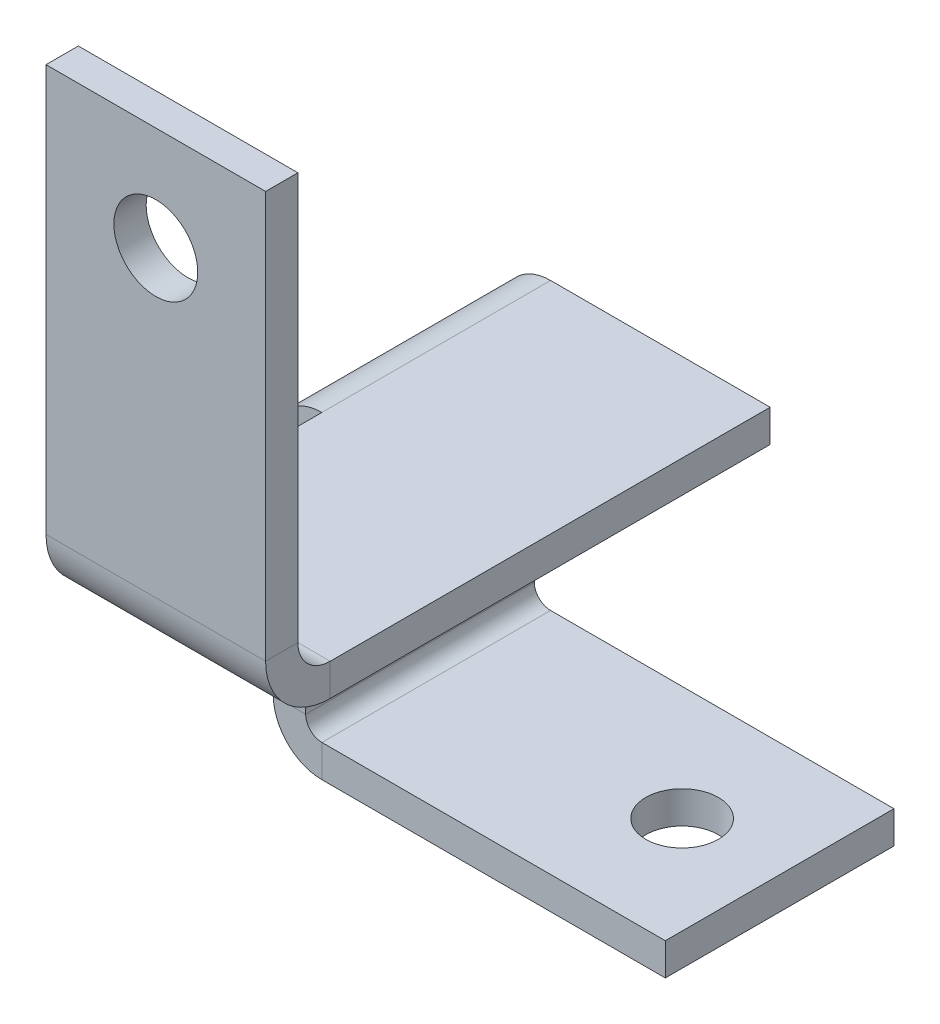
ISO-10303-21;
HEADER;
FILE_DESCRIPTION(('STEP AP214'),'2;1');
FILE_NAME('part.step','',(''),(''),'','','');
FILE_SCHEMA(('AUTOMOTIVE_DESIGN { 1 0 10303 214 1 1 1 1 }'));
ENDSEC;
DATA;
#1=APPLICATION_CONTEXT('core data for automotive mechanical design processes');
#2=APPLICATION_PROTOCOL_DEFINITION('international standard','automotive_design',2000,#1);
#3=PRODUCT_CONTEXT('',#1,'mechanical');
#4=PRODUCT('Part','Part','',(#3));
#5=PRODUCT_RELATED_PRODUCT_CATEGORY('part','',(#4));
#6=PRODUCT_DEFINITION_FORMATION('','',#4);
#7=PRODUCT_DEFINITION_CONTEXT('part definition',#1,'design');
#8=PRODUCT_DEFINITION('design','',#6,#7);
#9=PRODUCT_DEFINITION_SHAPE('','',#8);
#10=(LENGTH_UNIT() NAMED_UNIT(*) SI_UNIT(.MILLI.,.METRE.));
#11=(NAMED_UNIT(*) PLANE_ANGLE_UNIT() SI_UNIT($,.RADIAN.));
#12=(NAMED_UNIT(*) SI_UNIT($,.STERADIAN.) SOLID_ANGLE_UNIT());
#13=UNCERTAINTY_MEASURE_WITH_UNIT(LENGTH_MEASURE(1.E-05),#10,'distance_accuracy_value','');
#14=(GEOMETRIC_REPRESENTATION_CONTEXT(3) GLOBAL_UNCERTAINTY_ASSIGNED_CONTEXT((#13)) GLOBAL_UNIT_ASSIGNED_CONTEXT((#10,
#11,#12)) REPRESENTATION_CONTEXT('',''));
#15=CARTESIAN_POINT('',(0.,0.,0.));
#16=DIRECTION('',(0.,0.,1.));
#17=DIRECTION('',(1.,0.,0.));
#18=AXIS2_PLACEMENT_3D('',#15,#16,#17);
#19=CARTESIAN_POINT('',(-4.77500010200008,-52.8167025159296,-46.4337399999999));
#20=DIRECTION('',(0.,0.,1.));
#21=DIRECTION('',(0.,-1.,0.));
#22=AXIS2_PLACEMENT_3D('',#19,#20,#21);
#23=PLANE('',#22);
#24=DIRECTION('',(-1.,0.,0.));
#25=VECTOR('',#24,1.);
#26=CARTESIAN_POINT('',(-1.60000010200008,-48.0417024139297,-46.4337399999999));
#27=LINE('',#26,#25);
#28=CARTESIAN_POINT('',(-1.60000010200007,-48.0417024139296,-46.4337399999999));
#29=VERTEX_POINT('',#28);
#30=CARTESIAN_POINT('',(-4.77500010200009,-48.0417024139296,-46.4337399999999));
#31=VERTEX_POINT('',#30);
#32=EDGE_CURVE('E264',#29,#31,#27,.T.);
#33=ORIENTED_EDGE('',*,*,#32,.T.);
#34=DIRECTION('',(0.,-1.,0.));
#35=VECTOR('',#34,1.);
#36=CARTESIAN_POINT('',(-4.7750001019999,-1.49440522741454E-13,-46.4337400000001));
#37=LINE('',#36,#35);
#38=CARTESIAN_POINT('',(-4.77500010199999,-26.3166826179296,-46.43374));
#39=VERTEX_POINT('',#38);
#40=EDGE_CURVE('E283',#39,#31,#37,.T.);
#41=ORIENTED_EDGE('',*,*,#40,.F.);
#42=DIRECTION('',(1.,0.,0.));
#43=VECTOR('',#42,1.);
#44=CARTESIAN_POINT('',(-1.60000010199999,-26.3166826179296,-46.43374));
#45=LINE('',#44,#43);
#46=CARTESIAN_POINT('',(-1.60000010199999,-26.3166826179296,-46.43374));
#47=VERTEX_POINT('',#46);
#48=EDGE_CURVE('E292',#47,#39,#45,.F.);
#49=ORIENTED_EDGE('',*,*,#48,.F.);
#50=DIRECTION('',(0.,1.,0.));
#51=VECTOR('',#50,1.);
#52=CARTESIAN_POINT('',(-1.60000010200008,-52.8167025159296,-46.4337399999999));
#53=LINE('',#52,#51);
#54=EDGE_CURVE('E287',#47,#29,#53,.F.);
#55=ORIENTED_EDGE('',*,*,#54,.T.);
#56=EDGE_LOOP('',(#33,#41,#49,#55));
#57=FACE_BOUND('',#56,.T.);
#58=ADVANCED_FACE('F94',(#57),#23,.F.);
#59=CARTESIAN_POINT('',(-4.77500010200005,-44.0841825159296,-23.9521999999999));
#60=DIRECTION('',(0.,0.,-1.));
#61=DIRECTION('',(0.,1.,0.));
#62=AXIS2_PLACEMENT_3D('',#59,#60,#61);
#63=PLANE('',#62);
#64=DIRECTION('',(-1.,0.,0.));
#65=VECTOR('',#64,1.);
#66=CARTESIAN_POINT('',(-1.60000010200008,-48.0417024139296,-23.9521999999999));
#67=LINE('',#66,#65);
#68=CARTESIAN_POINT('',(-1.60000010200008,-48.0417024139296,-23.9521999999999));
#69=VERTEX_POINT('',#68);
#70=CARTESIAN_POINT('',(-4.77500010200007,-48.0417024139295,-23.9521999999999));
#71=VERTEX_POINT('',#70);
#72=EDGE_CURVE('E274',#69,#71,#67,.T.);
#73=ORIENTED_EDGE('',*,*,#72,.F.);
#74=DIRECTION('',(0.,-1.,0.));
#75=VECTOR('',#74,1.);
#76=CARTESIAN_POINT('',(-1.60000010200005,-44.0841825159296,-23.9521999999999));
#77=LINE('',#76,#75);
#78=CARTESIAN_POINT('',(-1.60000010199999,-26.3166826179296,-23.9522));
#79=VERTEX_POINT('',#78);
#80=EDGE_CURVE('E285',#69,#79,#77,.F.);
#81=ORIENTED_EDGE('',*,*,#80,.T.);
#82=DIRECTION('',(1.,0.,0.));
#83=VECTOR('',#82,1.);
#84=CARTESIAN_POINT('',(-4.77500010199999,-26.3166826179296,-23.9522));
#85=LINE('',#84,#83);
#86=CARTESIAN_POINT('',(-4.77500010199999,-26.3166826179296,-23.9522));
#87=VERTEX_POINT('',#86);
#88=EDGE_CURVE('E277',#79,#87,#85,.F.);
#89=ORIENTED_EDGE('',*,*,#88,.T.);
#90=DIRECTION('',(0.,1.,0.));
#91=VECTOR('',#90,1.);
#92=CARTESIAN_POINT('',(-4.7750001019999,0.,-23.9522000000001));
#93=LINE('',#92,#91);
#94=EDGE_CURVE('E280',#71,#87,#93,.T.);
#95=ORIENTED_EDGE('',*,*,#94,.F.);
#96=EDGE_LOOP('',(#73,#81,#89,#95));
#97=FACE_BOUND('',#96,.T.);
#98=ADVANCED_FACE('F431',(#97),#63,.F.);
#99=CARTESIAN_POINT('',(-4.7750001019999,0.,0.));
#100=DIRECTION('',(1.,0.,0.));
#101=DIRECTION('',(0.,1.,0.));
#102=AXIS2_PLACEMENT_3D('',#99,#100,#101);
#103=PLANE('',#102);
#104=DIRECTION('',(0.,0.,-1.));
#105=VECTOR('',#104,1.);
#106=CARTESIAN_POINT('',(-4.77500010200009,-48.0417024139296,-46.4337399999999));
#107=LINE('',#106,#105);
#108=EDGE_CURVE('E258',#31,#71,#107,.F.);
#109=ORIENTED_EDGE('',*,*,#108,.T.);
#110=ORIENTED_EDGE('',*,*,#94,.T.);
#111=DIRECTION('',(0.,0.,-1.));
#112=VECTOR('',#111,1.);
#113=CARTESIAN_POINT('',(-4.77500010199999,-26.3166826179296,-23.9521999999999));
#114=LINE('',#113,#112);
#115=EDGE_CURVE('E289',#39,#87,#114,.F.);
#116=ORIENTED_EDGE('',*,*,#115,.F.);
#117=ORIENTED_EDGE('',*,*,#40,.T.);
#118=EDGE_LOOP('',(#109,#110,#116,#117));
#119=FACE_BOUND('',#118,.T.);
#120=ADVANCED_FACE('F426',(#119),#103,.F.);
#121=CARTESIAN_POINT('',(-1.6000001019999,0.,0.));
#122=DIRECTION('',(1.,0.,0.));
#123=DIRECTION('',(0.,1.,0.));
#124=AXIS2_PLACEMENT_3D('',#121,#122,#123);
#125=PLANE('',#124);
#126=ORIENTED_EDGE('',*,*,#80,.F.);
#127=DIRECTION('',(0.,0.,-1.));
#128=VECTOR('',#127,1.);
#129=CARTESIAN_POINT('',(-1.60000010200008,-48.0417024139297,-46.4337399999999));
#130=LINE('',#129,#128);
#131=EDGE_CURVE('E109',#29,#69,#130,.F.);
#132=ORIENTED_EDGE('',*,*,#131,.F.);
#133=ORIENTED_EDGE('',*,*,#54,.F.);
#134=DIRECTION('',(0.,0.,-1.));
#135=VECTOR('',#134,1.);
#136=CARTESIAN_POINT('',(-1.60000010199999,-26.3166826179296,-23.9521999999999));
#137=LINE('',#136,#135);
#138=EDGE_CURVE('E295',#79,#47,#137,.T.);
#139=ORIENTED_EDGE('',*,*,#138,.F.);
#140=EDGE_LOOP('',(#126,#132,#133,#139));
#141=FACE_BOUND('',#140,.T.);
#142=ADVANCED_FACE('F419',(#141),#125,.T.);
#143=CARTESIAN_POINT('',(0.,-24.7166825159297,-46.43374));
#144=DIRECTION('',(1.,0.,0.));
#145=DIRECTION('',(0.,0.,-1.));
#146=AXIS2_PLACEMENT_3D('',#143,#144,#145);
#147=PLANE('',#146);
#148=DIRECTION('',(0.,1.,0.));
#149=VECTOR('',#148,1.);
#150=CARTESIAN_POINT('',(0.,-24.7166825159296,-23.9522));
#151=LINE('',#150,#149);
#152=CARTESIAN_POINT('',(0.,-24.7166825159296,-23.9522));
#153=VERTEX_POINT('',#152);
#154=CARTESIAN_POINT('',(0.,-21.5416825159296,-23.9522));
#155=VERTEX_POINT('',#154);
#156=EDGE_CURVE('E117',#153,#155,#151,.T.);
#157=ORIENTED_EDGE('',*,*,#156,.F.);
#158=DIRECTION('',(0.,0.,-1.));
#159=VECTOR('',#158,1.);
#160=CARTESIAN_POINT('',(0.,-24.7166825159297,-46.43374));
#161=LINE('',#160,#159);
#162=CARTESIAN_POINT('',(0.,-24.7166825159295,-3.17499999999998));
#163=VERTEX_POINT('',#162);
#164=EDGE_CURVE('E328',#163,#153,#161,.T.);
#165=ORIENTED_EDGE('',*,*,#164,.F.);
#166=DIRECTION('',(0.,-1.,0.));
#167=VECTOR('',#166,1.);
#168=CARTESIAN_POINT('',(0.,-21.5416825159295,-3.17499999999999));
#169=LINE('',#168,#167);
#170=CARTESIAN_POINT('',(0.,-21.5416825159295,-3.17499999999999));
#171=VERTEX_POINT('',#170);
#172=EDGE_CURVE('E320',#171,#163,#169,.T.);
#173=ORIENTED_EDGE('',*,*,#172,.F.);
#174=DIRECTION('',(0.,0.,-1.));
#175=VECTOR('',#174,1.);
#176=CARTESIAN_POINT('',(0.,-21.5416825159297,-46.43374));
#177=LINE('',#176,#175);
#178=EDGE_CURVE('E327',#171,#155,#177,.T.);
#179=ORIENTED_EDGE('',*,*,#178,.T.);
#180=EDGE_LOOP('',(#157,#165,#173,#179));
#181=FACE_BOUND('',#180,.T.);
#182=ADVANCED_FACE('F417',(#181),#147,.F.);
#183=CARTESIAN_POINT('',(0.,21.6383174840705,3.175));
#184=DIRECTION('',(1.,0.,0.));
#185=DIRECTION('',(0.,-1.,0.));
#186=AXIS2_PLACEMENT_3D('',#183,#184,#185);
#187=PLANE('',#186);
#188=DIRECTION('',(0.,1.,0.));
#189=VECTOR('',#188,1.);
#190=CARTESIAN_POINT('',(0.,0.,0.));
#191=LINE('',#190,#189);
#192=CARTESIAN_POINT('',(0.,21.6383174840705,0.));
#193=VERTEX_POINT('',#192);
#194=CARTESIAN_POINT('',(0.,-18.3666825159295,0.));
#195=VERTEX_POINT('',#194);
#196=EDGE_CURVE('E375',#193,#195,#191,.F.);
#197=ORIENTED_EDGE('',*,*,#196,.T.);
#198=DIRECTION('',(0.,0.,1.));
#199=VECTOR('',#198,1.);
#200=CARTESIAN_POINT('',(0.,-18.3666825159295,0.));
#201=LINE('',#200,#199);
#202=CARTESIAN_POINT('',(0.,-18.3666825159295,3.175));
#203=VERTEX_POINT('',#202);
#204=EDGE_CURVE('E354',#195,#203,#201,.T.);
#205=ORIENTED_EDGE('',*,*,#204,.T.);
#206=DIRECTION('',(0.,-1.,0.));
#207=VECTOR('',#206,1.);
#208=CARTESIAN_POINT('',(0.,21.6383174840705,3.175));
#209=LINE('',#208,#207);
#210=CARTESIAN_POINT('',(0.,21.6383174840705,3.175));
#211=VERTEX_POINT('',#210);
#212=EDGE_CURVE('E381',#211,#203,#209,.T.);
#213=ORIENTED_EDGE('',*,*,#212,.F.);
#214=DIRECTION('',(0.,0.,1.));
#215=VECTOR('',#214,1.);
#216=CARTESIAN_POINT('',(0.,21.6383174840705,3.175));
#217=LINE('',#216,#215);
#218=EDGE_CURVE('E102',#193,#211,#217,.T.);
#219=ORIENTED_EDGE('',*,*,#218,.F.);
#220=EDGE_LOOP('',(#197,#205,#213,#219));
#221=FACE_BOUND('',#220,.T.);
#222=ADVANCED_FACE('F402',(#221),#187,.F.);
#223=CARTESIAN_POINT('',(0.,0.,3.175));
#224=DIRECTION('',(0.,0.,-1.));
#225=DIRECTION('',(-1.,0.,0.));
#226=AXIS2_PLACEMENT_3D('',#223,#224,#225);
#227=PLANE('',#226);
#228=CARTESIAN_POINT('',(10.795,11.4186274840705,3.175));
#229=DIRECTION('',(0.,0.,-1.));
#230=DIRECTION('',(-1.,0.,0.));
#231=AXIS2_PLACEMENT_3D('',#228,#229,#230);
#232=CIRCLE('',#231,4.124999878);
#233=CARTESIAN_POINT('',(6.670000122,11.4186274840705,3.175));
#234=VERTEX_POINT('',#233);
#235=EDGE_CURVE('E371',#234,#234,#232,.T.);
#236=ORIENTED_EDGE('',*,*,#235,.T.);
#237=EDGE_LOOP('',(#236));
#238=FACE_BOUND('',#237,.T.);
#239=DIRECTION('',(-1.,0.,0.));
#240=VECTOR('',#239,1.);
#241=CARTESIAN_POINT('',(0.,-18.3666825159295,3.175));
#242=LINE('',#241,#240);
#243=CARTESIAN_POINT('',(21.59,-18.3666825159295,3.175));
#244=VERTEX_POINT('',#243);
#245=EDGE_CURVE('E348',#203,#244,#242,.F.);
#246=ORIENTED_EDGE('',*,*,#245,.T.);
#247=DIRECTION('',(0.,-1.,0.));
#248=VECTOR('',#247,1.);
#249=CARTESIAN_POINT('',(21.59,21.6383174840705,3.175));
#250=LINE('',#249,#248);
#251=CARTESIAN_POINT('',(21.59,21.6383174840705,3.175));
#252=VERTEX_POINT('',#251);
#253=EDGE_CURVE('E374',#252,#244,#250,.T.);
#254=ORIENTED_EDGE('',*,*,#253,.F.);
#255=DIRECTION('',(1.,0.,0.));
#256=VECTOR('',#255,1.);
#257=CARTESIAN_POINT('',(0.,21.6383174840705,3.175));
#258=LINE('',#257,#256);
#259=EDGE_CURVE('E378',#211,#252,#258,.T.);
#260=ORIENTED_EDGE('',*,*,#259,.F.);
#261=ORIENTED_EDGE('',*,*,#212,.T.);
#262=EDGE_LOOP('',(#246,#254,#260,#261));
#263=FACE_BOUND('',#262,.T.);
#264=ADVANCED_FACE('F401',(#238,#263),#227,.F.);
#265=CARTESIAN_POINT('',(0.,0.,0.));
#266=DIRECTION('',(0.,0.,-1.));
#267=DIRECTION('',(-1.,0.,0.));
#268=AXIS2_PLACEMENT_3D('',#265,#266,#267);
#269=PLANE('',#268);
#270=CARTESIAN_POINT('',(10.795,11.4186274840705,0.));
#271=DIRECTION('',(0.,0.,-1.));
#272=DIRECTION('',(-1.,0.,0.));
#273=AXIS2_PLACEMENT_3D('',#270,#271,#272);
#274=CIRCLE('',#273,4.124999878);
#275=CARTESIAN_POINT('',(6.670000122,11.4186274840705,0.));
#276=VERTEX_POINT('',#275);
#277=EDGE_CURVE('E368',#276,#276,#274,.T.);
#278=ORIENTED_EDGE('',*,*,#277,.F.);
#279=EDGE_LOOP('',(#278));
#280=FACE_BOUND('',#279,.T.);
#281=DIRECTION('',(0.,1.,0.));
#282=VECTOR('',#281,1.);
#283=CARTESIAN_POINT('',(21.59,0.,0.));
#284=LINE('',#283,#282);
#285=CARTESIAN_POINT('',(21.59,21.6383174840705,0.));
#286=VERTEX_POINT('',#285);
#287=CARTESIAN_POINT('',(21.59,-18.3666825159295,0.));
#288=VERTEX_POINT('',#287);
#289=EDGE_CURVE('E385',#286,#288,#284,.F.);
#290=ORIENTED_EDGE('',*,*,#289,.T.);
#291=DIRECTION('',(-1.,0.,0.));
#292=VECTOR('',#291,1.);
#293=CARTESIAN_POINT('',(0.,-18.3666825159295,0.));
#294=LINE('',#293,#292);
#295=EDGE_CURVE('E360',#195,#288,#294,.F.);
#296=ORIENTED_EDGE('',*,*,#295,.F.);
#297=ORIENTED_EDGE('',*,*,#196,.F.);
#298=DIRECTION('',(-1.,0.,0.));
#299=VECTOR('',#298,1.);
#300=CARTESIAN_POINT('',(0.,21.6383174840705,0.));
#301=LINE('',#300,#299);
#302=EDGE_CURVE('E388',#193,#286,#301,.F.);
#303=ORIENTED_EDGE('',*,*,#302,.T.);
#304=EDGE_LOOP('',(#290,#296,#297,#303));
#305=FACE_BOUND('',#304,.T.);
#306=ADVANCED_FACE('F485',(#280,#305),#269,.T.);
#307=CARTESIAN_POINT('',(0.,21.6383174840705,3.175));
#308=DIRECTION('',(0.,1.,0.));
#309=DIRECTION('',(1.,0.,0.));
#310=AXIS2_PLACEMENT_3D('',#307,#308,#309);
#311=PLANE('',#310);
#312=DIRECTION('',(0.,0.,1.));
#313=VECTOR('',#312,1.);
#314=CARTESIAN_POINT('',(21.59,21.6383174840705,3.175));
#315=LINE('',#314,#313);
#316=EDGE_CURVE('E13',#286,#252,#315,.T.);
#317=ORIENTED_EDGE('',*,*,#316,.F.);
#318=ORIENTED_EDGE('',*,*,#302,.F.);
#319=ORIENTED_EDGE('',*,*,#218,.T.);
#320=ORIENTED_EDGE('',*,*,#259,.T.);
#321=EDGE_LOOP('',(#317,#318,#319,#320));
#322=FACE_BOUND('',#321,.T.);
#323=ADVANCED_FACE('F395',(#322),#311,.T.);
#324=CARTESIAN_POINT('',(10.795,11.4186274840705,3.175));
#325=DIRECTION('',(0.,0.,-1.));
#326=DIRECTION('',(-1.,0.,0.));
#327=AXIS2_PLACEMENT_3D('',#324,#325,#326);
#328=CYLINDRICAL_SURFACE('',#327,4.124999878);
#329=ORIENTED_EDGE('',*,*,#235,.F.);
#330=EDGE_LOOP('',(#329));
#331=FACE_BOUND('',#330,.T.);
#332=ORIENTED_EDGE('',*,*,#277,.T.);
#333=EDGE_LOOP('',(#332));
#334=FACE_BOUND('',#333,.T.);
#335=ADVANCED_FACE('F493',(#331,#334),#328,.F.);
#336=CARTESIAN_POINT('',(21.59,21.6383174840705,3.175));
#337=DIRECTION('',(1.,0.,0.));
#338=DIRECTION('',(0.,-1.,0.));
#339=AXIS2_PLACEMENT_3D('',#336,#337,#338);
#340=PLANE('',#339);
#341=DIRECTION('',(0.,0.,1.));
#342=VECTOR('',#341,1.);
#343=CARTESIAN_POINT('',(21.59,-18.3666825159295,0.));
#344=LINE('',#343,#342);
#345=EDGE_CURVE('E365',#288,#244,#344,.T.);
#346=ORIENTED_EDGE('',*,*,#345,.F.);
#347=ORIENTED_EDGE('',*,*,#289,.F.);
#348=ORIENTED_EDGE('',*,*,#316,.T.);
#349=ORIENTED_EDGE('',*,*,#253,.T.);
#350=EDGE_LOOP('',(#346,#347,#348,#349));
#351=FACE_BOUND('',#350,.T.);
#352=ADVANCED_FACE('F96',(#351),#340,.T.);
#353=CARTESIAN_POINT('',(21.59,-18.3666825159295,-3.175));
#354=DIRECTION('',(1.,0.,0.));
#355=DIRECTION('',(0.,0.,-1.));
#356=AXIS2_PLACEMENT_3D('',#353,#354,#355);
#357=PLANE('',#356);
#358=DIRECTION('',(0.,-1.,0.));
#359=VECTOR('',#358,1.);
#360=CARTESIAN_POINT('',(21.59,-21.5416825159295,-3.17499999999999));
#361=LINE('',#360,#359);
#362=CARTESIAN_POINT('',(21.59,-21.5416825159295,-3.17499999999999));
#363=VERTEX_POINT('',#362);
#364=CARTESIAN_POINT('',(21.59,-24.7166825159295,-3.17499999999998));
#365=VERTEX_POINT('',#364);
#366=EDGE_CURVE('E317',#363,#365,#361,.T.);
#367=ORIENTED_EDGE('',*,*,#366,.F.);
#368=CARTESIAN_POINT('',(21.59,-18.3666825159295,-3.175));
#369=DIRECTION('',(-1.,0.,0.));
#370=DIRECTION('',(0.,0.,1.));
#371=AXIS2_PLACEMENT_3D('',#368,#369,#370);
#372=CIRCLE('',#371,3.175);
#373=EDGE_CURVE('E357',#288,#363,#372,.F.);
#374=ORIENTED_EDGE('',*,*,#373,.F.);
#375=ORIENTED_EDGE('',*,*,#345,.T.);
#376=CARTESIAN_POINT('',(21.59,-18.3666825159295,-3.175));
#377=DIRECTION('',(-1.,0.,0.));
#378=DIRECTION('',(0.,0.,1.));
#379=AXIS2_PLACEMENT_3D('',#376,#377,#378);
#380=CIRCLE('',#379,6.35);
#381=EDGE_CURVE('E350',#244,#365,#380,.F.);
#382=ORIENTED_EDGE('',*,*,#381,.T.);
#383=EDGE_LOOP('',(#367,#374,#375,#382));
#384=FACE_BOUND('',#383,.T.);
#385=ADVANCED_FACE('F481',(#384),#357,.T.);
#386=CARTESIAN_POINT('',(0.,-18.3666825159295,-3.175));
#387=DIRECTION('',(1.,0.,0.));
#388=DIRECTION('',(0.,0.,-1.));
#389=AXIS2_PLACEMENT_3D('',#386,#387,#388);
#390=PLANE('',#389);
#391=CARTESIAN_POINT('',(0.,-18.3666825159295,-3.175));
#392=DIRECTION('',(-1.,0.,0.));
#393=DIRECTION('',(0.,0.,1.));
#394=AXIS2_PLACEMENT_3D('',#391,#392,#393);
#395=CIRCLE('',#394,3.175);
#396=EDGE_CURVE('E347',#171,#195,#395,.T.);
#397=ORIENTED_EDGE('',*,*,#396,.F.);
#398=ORIENTED_EDGE('',*,*,#172,.T.);
#399=CARTESIAN_POINT('',(0.,-18.3666825159295,-3.175));
#400=DIRECTION('',(-1.,0.,0.));
#401=DIRECTION('',(0.,0.,1.));
#402=AXIS2_PLACEMENT_3D('',#399,#400,#401);
#403=CIRCLE('',#402,6.35);
#404=EDGE_CURVE('E351',#163,#203,#403,.T.);
#405=ORIENTED_EDGE('',*,*,#404,.T.);
#406=ORIENTED_EDGE('',*,*,#204,.F.);
#407=EDGE_LOOP('',(#397,#398,#405,#406));
#408=FACE_BOUND('',#407,.T.);
#409=ADVANCED_FACE('F410',(#408),#390,.F.);
#410=CARTESIAN_POINT('',(0.,-18.3666825159295,-3.175));
#411=DIRECTION('',(-1.,0.,0.));
#412=DIRECTION('',(0.,-1.,0.));
#413=AXIS2_PLACEMENT_3D('',#410,#411,#412);
#414=CYLINDRICAL_SURFACE('',#413,6.35);
#415=ORIENTED_EDGE('',*,*,#245,.F.);
#416=ORIENTED_EDGE('',*,*,#404,.F.);
#417=DIRECTION('',(1.,0.,0.));
#418=VECTOR('',#417,1.);
#419=CARTESIAN_POINT('',(0.,-24.7166825159295,-3.17499999999998));
#420=LINE('',#419,#418);
#421=EDGE_CURVE('E323',#163,#365,#420,.T.);
#422=ORIENTED_EDGE('',*,*,#421,.T.);
#423=ORIENTED_EDGE('',*,*,#381,.F.);
#424=EDGE_LOOP('',(#415,#416,#422,#423));
#425=FACE_BOUND('',#424,.T.);
#426=ADVANCED_FACE('F409',(#425),#414,.T.);
#427=CARTESIAN_POINT('',(0.,-18.3666825159295,-3.175));
#428=DIRECTION('',(-1.,0.,0.));
#429=DIRECTION('',(0.,-1.,0.));
#430=AXIS2_PLACEMENT_3D('',#427,#428,#429);
#431=CYLINDRICAL_SURFACE('',#430,3.175);
#432=ORIENTED_EDGE('',*,*,#295,.T.);
#433=ORIENTED_EDGE('',*,*,#373,.T.);
#434=DIRECTION('',(-1.,0.,0.));
#435=VECTOR('',#434,1.);
#436=CARTESIAN_POINT('',(21.59,-21.5416825159295,-3.17499999999999));
#437=LINE('',#436,#435);
#438=EDGE_CURVE('E318',#363,#171,#437,.T.);
#439=ORIENTED_EDGE('',*,*,#438,.T.);
#440=ORIENTED_EDGE('',*,*,#396,.T.);
#441=EDGE_LOOP('',(#432,#433,#439,#440));
#442=FACE_BOUND('',#441,.T.);
#443=ADVANCED_FACE('F466',(#442),#431,.F.);
#444=CARTESIAN_POINT('',(21.59,-24.7166825159295,0.));
#445=DIRECTION('',(-1.,0.,0.));
#446=DIRECTION('',(0.,0.,1.));
#447=AXIS2_PLACEMENT_3D('',#444,#445,#446);
#448=PLANE('',#447);
#449=ORIENTED_EDGE('',*,*,#366,.T.);
#450=DIRECTION('',(0.,0.,1.));
#451=VECTOR('',#450,1.);
#452=CARTESIAN_POINT('',(21.59,-24.7166825159295,0.));
#453=LINE('',#452,#451);
#454=CARTESIAN_POINT('',(21.59,-24.7166825159297,-46.43374));
#455=VERTEX_POINT('',#454);
#456=EDGE_CURVE('E333',#455,#365,#453,.T.);
#457=ORIENTED_EDGE('',*,*,#456,.F.);
#458=DIRECTION('',(0.,1.,0.));
#459=VECTOR('',#458,1.);
#460=CARTESIAN_POINT('',(21.59,-24.7166825159297,-46.43374));
#461=LINE('',#460,#459);
#462=CARTESIAN_POINT('',(21.59,-21.5416825159297,-46.43374));
#463=VERTEX_POINT('',#462);
#464=EDGE_CURVE('E336',#455,#463,#461,.T.);
#465=ORIENTED_EDGE('',*,*,#464,.T.);
#466=DIRECTION('',(0.,0.,1.));
#467=VECTOR('',#466,1.);
#468=CARTESIAN_POINT('',(21.59,-21.5416825159295,0.));
#469=LINE('',#468,#467);
#470=EDGE_CURVE('E331',#463,#363,#469,.T.);
#471=ORIENTED_EDGE('',*,*,#470,.T.);
#472=EDGE_LOOP('',(#449,#457,#465,#471));
#473=FACE_BOUND('',#472,.T.);
#474=ADVANCED_FACE('F461',(#473),#448,.F.);
#475=CARTESIAN_POINT('',(0.,-24.7166825159295,0.));
#476=DIRECTION('',(0.,1.,0.));
#477=DIRECTION('',(0.,0.,1.));
#478=AXIS2_PLACEMENT_3D('',#475,#476,#477);
#479=PLANE('',#478);
#480=ORIENTED_EDGE('',*,*,#421,.F.);
#481=ORIENTED_EDGE('',*,*,#164,.T.);
#482=DIRECTION('',(0.,0.,-1.));
#483=VECTOR('',#482,1.);
#484=CARTESIAN_POINT('',(0.,-24.7166825159296,-46.43374));
#485=LINE('',#484,#483);
#486=CARTESIAN_POINT('',(0.,-24.7166825159297,-46.43374));
#487=VERTEX_POINT('',#486);
#488=EDGE_CURVE('E311',#487,#153,#485,.F.);
#489=ORIENTED_EDGE('',*,*,#488,.F.);
#490=DIRECTION('',(1.,0.,0.));
#491=VECTOR('',#490,1.);
#492=CARTESIAN_POINT('',(21.59,-24.7166825159297,-46.43374));
#493=LINE('',#492,#491);
#494=EDGE_CURVE('E330',#487,#455,#493,.T.);
#495=ORIENTED_EDGE('',*,*,#494,.T.);
#496=ORIENTED_EDGE('',*,*,#456,.T.);
#497=EDGE_LOOP('',(#480,#481,#489,#495,#496));
#498=FACE_BOUND('',#497,.T.);
#499=ADVANCED_FACE('F415',(#498),#479,.F.);
#500=CARTESIAN_POINT('',(0.,-21.5416825159295,0.));
#501=DIRECTION('',(0.,1.,0.));
#502=DIRECTION('',(0.,0.,1.));
#503=AXIS2_PLACEMENT_3D('',#500,#501,#502);
#504=PLANE('',#503);
#505=ORIENTED_EDGE('',*,*,#178,.F.);
#506=ORIENTED_EDGE('',*,*,#438,.F.);
#507=ORIENTED_EDGE('',*,*,#470,.F.);
#508=DIRECTION('',(1.,0.,0.));
#509=VECTOR('',#508,1.);
#510=CARTESIAN_POINT('',(21.59,-21.5416825159297,-46.43374));
#511=LINE('',#510,#509);
#512=CARTESIAN_POINT('',(0.,-21.5416825159297,-46.43374));
#513=VERTEX_POINT('',#512);
#514=EDGE_CURVE('E338',#513,#463,#511,.T.);
#515=ORIENTED_EDGE('',*,*,#514,.F.);
#516=DIRECTION('',(0.,0.,-1.));
#517=VECTOR('',#516,1.);
#518=CARTESIAN_POINT('',(0.,-21.5416825159296,-46.43374));
#519=LINE('',#518,#517);
#520=EDGE_CURVE('E299',#513,#155,#519,.F.);
#521=ORIENTED_EDGE('',*,*,#520,.T.);
#522=EDGE_LOOP('',(#505,#506,#507,#515,#521));
#523=FACE_BOUND('',#522,.T.);
#524=ADVANCED_FACE('F460',(#523),#504,.T.);
#525=CARTESIAN_POINT('',(21.59,-24.7166825159297,-46.43374));
#526=DIRECTION('',(0.,0.,1.));
#527=DIRECTION('',(0.,-1.,0.));
#528=AXIS2_PLACEMENT_3D('',#525,#526,#527);
#529=PLANE('',#528);
#530=ORIENTED_EDGE('',*,*,#514,.T.);
#531=ORIENTED_EDGE('',*,*,#464,.F.);
#532=ORIENTED_EDGE('',*,*,#494,.F.);
#533=DIRECTION('',(0.,1.,0.));
#534=VECTOR('',#533,1.);
#535=CARTESIAN_POINT('',(0.,-24.7166825159297,-46.43374));
#536=LINE('',#535,#534);
#537=EDGE_CURVE('E344',#487,#513,#536,.T.);
#538=ORIENTED_EDGE('',*,*,#537,.T.);
#539=EDGE_LOOP('',(#530,#531,#532,#538));
#540=FACE_BOUND('',#539,.T.);
#541=ADVANCED_FACE('F453',(#540),#529,.F.);
#542=CARTESIAN_POINT('',(0.,-26.3166826179296,-23.9522));
#543=DIRECTION('',(0.,0.,1.));
#544=DIRECTION('',(0.,-1.,0.));
#545=AXIS2_PLACEMENT_3D('',#542,#543,#544);
#546=PLANE('',#545);
#547=ORIENTED_EDGE('',*,*,#88,.F.);
#548=CARTESIAN_POINT('',(0.,-26.3166826179296,-23.9522));
#549=DIRECTION('',(0.,0.,-1.));
#550=DIRECTION('',(0.,1.,0.));
#551=AXIS2_PLACEMENT_3D('',#548,#549,#550);
#552=CIRCLE('',#551,1.600000102);
#553=EDGE_CURVE('E308',#153,#79,#552,.F.);
#554=ORIENTED_EDGE('',*,*,#553,.F.);
#555=ORIENTED_EDGE('',*,*,#156,.T.);
#556=CARTESIAN_POINT('',(0.,-26.3166826179296,-23.9522));
#557=DIRECTION('',(0.,0.,-1.));
#558=DIRECTION('',(0.,1.,0.));
#559=AXIS2_PLACEMENT_3D('',#556,#557,#558);
#560=CIRCLE('',#559,4.775000102);
#561=EDGE_CURVE('E302',#155,#87,#560,.F.);
#562=ORIENTED_EDGE('',*,*,#561,.T.);
#563=EDGE_LOOP('',(#547,#554,#555,#562));
#564=FACE_BOUND('',#563,.T.);
#565=ADVANCED_FACE('F450',(#564),#546,.T.);
#566=CARTESIAN_POINT('',(0.,-26.3166826179296,-46.43374));
#567=DIRECTION('',(0.,0.,1.));
#568=DIRECTION('',(0.,-1.,0.));
#569=AXIS2_PLACEMENT_3D('',#566,#567,#568);
#570=PLANE('',#569);
#571=CARTESIAN_POINT('',(0.,-26.3166826179296,-46.43374));
#572=DIRECTION('',(0.,0.,-1.));
#573=DIRECTION('',(0.,1.,0.));
#574=AXIS2_PLACEMENT_3D('',#571,#572,#573);
#575=CIRCLE('',#574,1.600000102);
#576=EDGE_CURVE('E282',#47,#487,#575,.T.);
#577=ORIENTED_EDGE('',*,*,#576,.F.);
#578=ORIENTED_EDGE('',*,*,#48,.T.);
#579=CARTESIAN_POINT('',(0.,-26.3166826179296,-46.43374));
#580=DIRECTION('',(0.,0.,-1.));
#581=DIRECTION('',(0.,1.,0.));
#582=AXIS2_PLACEMENT_3D('',#579,#580,#581);
#583=CIRCLE('',#582,4.775000102);
#584=EDGE_CURVE('E303',#39,#513,#583,.T.);
#585=ORIENTED_EDGE('',*,*,#584,.T.);
#586=ORIENTED_EDGE('',*,*,#537,.F.);
#587=EDGE_LOOP('',(#577,#578,#585,#586));
#588=FACE_BOUND('',#587,.T.);
#589=ADVANCED_FACE('F444',(#588),#570,.F.);
#590=CARTESIAN_POINT('',(0.,-26.3166826179296,-46.43374));
#591=DIRECTION('',(0.,0.,-1.));
#592=DIRECTION('',(-1.,0.,0.));
#593=AXIS2_PLACEMENT_3D('',#590,#591,#592);
#594=CYLINDRICAL_SURFACE('',#593,4.775000102);
#595=ORIENTED_EDGE('',*,*,#520,.F.);
#596=ORIENTED_EDGE('',*,*,#584,.F.);
#597=ORIENTED_EDGE('',*,*,#115,.T.);
#598=ORIENTED_EDGE('',*,*,#561,.F.);
#599=EDGE_LOOP('',(#595,#596,#597,#598));
#600=FACE_BOUND('',#599,.T.);
#601=ADVANCED_FACE('F440',(#600),#594,.T.);
#602=CARTESIAN_POINT('',(0.,-26.3166826179296,-46.43374));
#603=DIRECTION('',(0.,0.,-1.));
#604=DIRECTION('',(-1.,0.,0.));
#605=AXIS2_PLACEMENT_3D('',#602,#603,#604);
#606=CYLINDRICAL_SURFACE('',#605,1.600000102);
#607=ORIENTED_EDGE('',*,*,#488,.T.);
#608=ORIENTED_EDGE('',*,*,#553,.T.);
#609=ORIENTED_EDGE('',*,*,#138,.T.);
#610=ORIENTED_EDGE('',*,*,#576,.T.);
#611=EDGE_LOOP('',(#607,#608,#609,#610));
#612=FACE_BOUND('',#611,.T.);
#613=ADVANCED_FACE('F443',(#612),#606,.F.);
#614=CARTESIAN_POINT('',(0.,-48.0417024139296,-23.9521999999999));
#615=DIRECTION('',(0.,0.,1.));
#616=DIRECTION('',(0.,-1.,0.));
#617=AXIS2_PLACEMENT_3D('',#614,#615,#616);
#618=PLANE('',#617);
#619=DIRECTION('',(0.,1.,0.));
#620=VECTOR('',#619,1.);
#621=CARTESIAN_POINT('',(-1.01047642475649E-13,-52.8167025159296,-23.9521999999999));
#622=LINE('',#621,#620);
#623=CARTESIAN_POINT('',(0.,-49.6417025159296,-23.9521999999999));
#624=VERTEX_POINT('',#623);
#625=CARTESIAN_POINT('',(-1.0092425600659E-13,-52.8167025159296,-23.9521999999999));
#626=VERTEX_POINT('',#625);
#627=EDGE_CURVE('E239',#624,#626,#622,.F.);
#628=ORIENTED_EDGE('',*,*,#627,.F.);
#629=CARTESIAN_POINT('',(0.,-48.0417024139296,-23.9521999999999));
#630=DIRECTION('',(0.,0.,-1.));
#631=DIRECTION('',(0.,1.,0.));
#632=AXIS2_PLACEMENT_3D('',#629,#630,#631);
#633=CIRCLE('',#632,1.60000010200001);
#634=EDGE_CURVE('E267',#69,#624,#633,.F.);
#635=ORIENTED_EDGE('',*,*,#634,.F.);
#636=ORIENTED_EDGE('',*,*,#72,.T.);
#637=CARTESIAN_POINT('',(0.,-48.0417024139296,-23.9521999999999));
#638=DIRECTION('',(0.,0.,-1.));
#639=DIRECTION('',(0.,1.,0.));
#640=AXIS2_PLACEMENT_3D('',#637,#638,#639);
#641=CIRCLE('',#640,4.77500010200001);
#642=EDGE_CURVE('E260',#71,#626,#641,.F.);
#643=ORIENTED_EDGE('',*,*,#642,.T.);
#644=EDGE_LOOP('',(#628,#635,#636,#643));
#645=FACE_BOUND('',#644,.T.);
#646=ADVANCED_FACE('F448',(#645),#618,.T.);
#647=CARTESIAN_POINT('',(0.,-48.0417024139297,-46.4337399999999));
#648=DIRECTION('',(0.,0.,1.));
#649=DIRECTION('',(0.,-1.,0.));
#650=AXIS2_PLACEMENT_3D('',#647,#648,#649);
#651=PLANE('',#650);
#652=CARTESIAN_POINT('',(0.,-48.0417024139297,-46.4337399999999));
#653=DIRECTION('',(0.,0.,-1.));
#654=DIRECTION('',(0.,1.,0.));
#655=AXIS2_PLACEMENT_3D('',#652,#653,#654);
#656=CIRCLE('',#655,1.60000010200001);
#657=CARTESIAN_POINT('',(0.,-49.6417025159297,-46.4337399999999));
#658=VERTEX_POINT('',#657);
#659=EDGE_CURVE('E271',#658,#29,#656,.T.);
#660=ORIENTED_EDGE('',*,*,#659,.F.);
#661=DIRECTION('',(0.,1.,0.));
#662=VECTOR('',#661,1.);
#663=CARTESIAN_POINT('',(0.,-49.6417025159297,-46.4337399999999));
#664=LINE('',#663,#662);
#665=CARTESIAN_POINT('',(-1.07863149910497E-13,-52.8167025159297,-46.4337399999999));
#666=VERTEX_POINT('',#665);
#667=EDGE_CURVE('E251',#658,#666,#664,.F.);
#668=ORIENTED_EDGE('',*,*,#667,.T.);
#669=CARTESIAN_POINT('',(0.,-48.0417024139297,-46.4337399999999));
#670=DIRECTION('',(0.,0.,-1.));
#671=DIRECTION('',(0.,1.,0.));
#672=AXIS2_PLACEMENT_3D('',#669,#670,#671);
#673=CIRCLE('',#672,4.77500010200001);
#674=EDGE_CURVE('E261',#666,#31,#673,.T.);
#675=ORIENTED_EDGE('',*,*,#674,.T.);
#676=ORIENTED_EDGE('',*,*,#32,.F.);
#677=EDGE_LOOP('',(#660,#668,#675,#676));
#678=FACE_BOUND('',#677,.T.);
#679=ADVANCED_FACE('F606',(#678),#651,.F.);
#680=CARTESIAN_POINT('',(0.,-48.0417024139297,-46.4337399999999));
#681=DIRECTION('',(0.,0.,-1.));
#682=DIRECTION('',(0.,-1.,0.));
#683=AXIS2_PLACEMENT_3D('',#680,#681,#682);
#684=CYLINDRICAL_SURFACE('',#683,4.77500010200001);
#685=ORIENTED_EDGE('',*,*,#108,.F.);
#686=ORIENTED_EDGE('',*,*,#674,.F.);
#687=DIRECTION('',(0.,0.,-1.));
#688=VECTOR('',#687,1.);
#689=CARTESIAN_POINT('',(-1.0092425600659E-13,-52.8167025159296,-23.9521999999999));
#690=LINE('',#689,#688);
#691=EDGE_CURVE('E249',#666,#626,#690,.F.);
#692=ORIENTED_EDGE('',*,*,#691,.T.);
#693=ORIENTED_EDGE('',*,*,#642,.F.);
#694=EDGE_LOOP('',(#685,#686,#692,#693));
#695=FACE_BOUND('',#694,.T.);
#696=ADVANCED_FACE('F616',(#695),#684,.T.);
#697=CARTESIAN_POINT('',(0.,-48.0417024139297,-46.4337399999999));
#698=DIRECTION('',(0.,0.,-1.));
#699=DIRECTION('',(0.,-1.,0.));
#700=AXIS2_PLACEMENT_3D('',#697,#698,#699);
#701=CYLINDRICAL_SURFACE('',#700,1.60000010200001);
#702=ORIENTED_EDGE('',*,*,#131,.T.);
#703=ORIENTED_EDGE('',*,*,#634,.T.);
#704=DIRECTION('',(0.,0.,-1.));
#705=VECTOR('',#704,1.);
#706=CARTESIAN_POINT('',(0.,-49.6417025159296,-23.9521999999999));
#707=LINE('',#706,#705);
#708=EDGE_CURVE('E254',#624,#658,#707,.T.);
#709=ORIENTED_EDGE('',*,*,#708,.T.);
#710=ORIENTED_EDGE('',*,*,#659,.T.);
#711=EDGE_LOOP('',(#702,#703,#709,#710));
#712=FACE_BOUND('',#711,.T.);
#713=ADVANCED_FACE('F627',(#712),#701,.F.);
#714=CARTESIAN_POINT('',(33.7642199999999,-52.8167025159299,-46.4337399999999));
#715=DIRECTION('',(0.,0.,1.));
#716=DIRECTION('',(0.,-1.,0.));
#717=AXIS2_PLACEMENT_3D('',#714,#715,#716);
#718=PLANE('',#717);
#719=ORIENTED_EDGE('',*,*,#667,.F.);
#720=DIRECTION('',(-1.,0.,0.));
#721=VECTOR('',#720,1.);
#722=CARTESIAN_POINT('',(33.7642199999999,-49.6417025159299,-46.4337399999999));
#723=LINE('',#722,#721);
#724=CARTESIAN_POINT('',(33.7642199999999,-49.6417025159299,-46.4337399999999));
#725=VERTEX_POINT('',#724);
#726=EDGE_CURVE('E247',#658,#725,#723,.F.);
#727=ORIENTED_EDGE('',*,*,#726,.T.);
#728=DIRECTION('',(0.,1.,0.));
#729=VECTOR('',#728,1.);
#730=CARTESIAN_POINT('',(33.7642199999999,-52.8167025159299,-46.4337399999999));
#731=LINE('',#730,#729);
#732=CARTESIAN_POINT('',(33.7642199999999,-52.8167025159299,-46.4337399999999));
#733=VERTEX_POINT('',#732);
#734=EDGE_CURVE('E235',#733,#725,#731,.T.);
#735=ORIENTED_EDGE('',*,*,#734,.F.);
#736=DIRECTION('',(1.,0.,0.));
#737=VECTOR('',#736,1.);
#738=CARTESIAN_POINT('',(-3.64689562077208E-13,-52.8167025159297,-46.4337399999999));
#739=LINE('',#738,#737);
#740=EDGE_CURVE('E222',#666,#733,#739,.T.);
#741=ORIENTED_EDGE('',*,*,#740,.F.);
#742=EDGE_LOOP('',(#719,#727,#735,#741));
#743=FACE_BOUND('',#742,.T.);
#744=ADVANCED_FACE('F638',(#743),#718,.F.);
#745=CARTESIAN_POINT('',(-1.60000010200009,-52.8167025159296,-23.9521999999999));
#746=DIRECTION('',(0.,0.,-1.));
#747=DIRECTION('',(0.,1.,0.));
#748=AXIS2_PLACEMENT_3D('',#745,#746,#747);
#749=PLANE('',#748);
#750=ORIENTED_EDGE('',*,*,#627,.T.);
#751=DIRECTION('',(-1.,0.,0.));
#752=VECTOR('',#751,1.);
#753=CARTESIAN_POINT('',(-3.73800431608397E-13,-52.8167025159296,-23.9521999999999));
#754=LINE('',#753,#752);
#755=CARTESIAN_POINT('',(33.7642199999999,-52.8167025159298,-23.9521999999999));
#756=VERTEX_POINT('',#755);
#757=EDGE_CURVE('E220',#756,#626,#754,.T.);
#758=ORIENTED_EDGE('',*,*,#757,.F.);
#759=DIRECTION('',(0.,1.,0.));
#760=VECTOR('',#759,1.);
#761=CARTESIAN_POINT('',(33.7642199999999,-52.8167025159298,-23.9521999999999));
#762=LINE('',#761,#760);
#763=CARTESIAN_POINT('',(33.7642199999999,-49.6417025159298,-23.9521999999999));
#764=VERTEX_POINT('',#763);
#765=EDGE_CURVE('E228',#756,#764,#762,.T.);
#766=ORIENTED_EDGE('',*,*,#765,.T.);
#767=DIRECTION('',(1.,0.,0.));
#768=VECTOR('',#767,1.);
#769=CARTESIAN_POINT('',(-1.60000010200007,-49.6417025159296,-23.9521999999999));
#770=LINE('',#769,#768);
#771=EDGE_CURVE('E244',#764,#624,#770,.F.);
#772=ORIENTED_EDGE('',*,*,#771,.T.);
#773=EDGE_LOOP('',(#750,#758,#766,#772));
#774=FACE_BOUND('',#773,.T.);
#775=ADVANCED_FACE('F238',(#774),#749,.F.);
#776=CARTESIAN_POINT('',(-3.73800431608397E-13,-52.8167025159295,1.79319763959004E-13));
#777=DIRECTION('',(0.,1.,0.));
#778=DIRECTION('',(-1.,0.,0.));
#779=AXIS2_PLACEMENT_3D('',#776,#777,#778);
#780=PLANE('',#779);
#781=CARTESIAN_POINT('',(24.1731799999999,-52.8167025159298,-35.1929699999999));
#782=DIRECTION('',(0.,-1.,0.));
#783=DIRECTION('',(1.,0.,0.));
#784=AXIS2_PLACEMENT_3D('',#781,#782,#783);
#785=CIRCLE('',#784,3.57124);
#786=CARTESIAN_POINT('',(27.7444199999999,-52.8167025159298,-35.1929699999999));
#787=VERTEX_POINT('',#786);
#788=EDGE_CURVE('E257',#787,#787,#785,.T.);
#789=ORIENTED_EDGE('',*,*,#788,.F.);
#790=EDGE_LOOP('',(#789));
#791=FACE_BOUND('',#790,.T.);
#792=ORIENTED_EDGE('',*,*,#691,.F.);
#793=ORIENTED_EDGE('',*,*,#740,.T.);
#794=DIRECTION('',(0.,0.,1.));
#795=VECTOR('',#794,1.);
#796=CARTESIAN_POINT('',(33.7642199999999,-52.8167025159297,1.79319763959005E-13));
#797=LINE('',#796,#795);
#798=EDGE_CURVE('E215',#733,#756,#797,.T.);
#799=ORIENTED_EDGE('',*,*,#798,.T.);
#800=ORIENTED_EDGE('',*,*,#757,.T.);
#801=EDGE_LOOP('',(#792,#793,#799,#800));
#802=FACE_BOUND('',#801,.T.);
#803=ADVANCED_FACE('F218',(#791,#802),#780,.F.);
#804=CARTESIAN_POINT('',(-3.51629525106743E-13,-49.6417025159295,1.6854021462235E-13));
#805=DIRECTION('',(0.,1.,0.));
#806=DIRECTION('',(-1.,0.,0.));
#807=AXIS2_PLACEMENT_3D('',#804,#805,#806);
#808=PLANE('',#807);
#809=CARTESIAN_POINT('',(24.1731799999999,-49.6417025159298,-35.1929699999999));
#810=DIRECTION('',(0.,1.,0.));
#811=DIRECTION('',(-1.,0.,0.));
#812=AXIS2_PLACEMENT_3D('',#809,#810,#811);
#813=CIRCLE('',#812,3.57124);
#814=CARTESIAN_POINT('',(20.6019399999999,-49.6417025159298,-35.1929699999999));
#815=VERTEX_POINT('',#814);
#816=EDGE_CURVE('E717',#815,#815,#813,.F.);
#817=ORIENTED_EDGE('',*,*,#816,.T.);
#818=EDGE_LOOP('',(#817));
#819=FACE_BOUND('',#818,.T.);
#820=ORIENTED_EDGE('',*,*,#726,.F.);
#821=ORIENTED_EDGE('',*,*,#708,.F.);
#822=ORIENTED_EDGE('',*,*,#771,.F.);
#823=DIRECTION('',(0.,0.,-1.));
#824=VECTOR('',#823,1.);
#825=CARTESIAN_POINT('',(33.7642199999999,-49.6417025159298,-23.9521999999999));
#826=LINE('',#825,#824);
#827=EDGE_CURVE('E231',#725,#764,#826,.F.);
#828=ORIENTED_EDGE('',*,*,#827,.F.);
#829=EDGE_LOOP('',(#820,#821,#822,#828));
#830=FACE_BOUND('',#829,.T.);
#831=ADVANCED_FACE('F671',(#819,#830),#808,.T.);
#832=CARTESIAN_POINT('',(33.7642199999999,-52.8167025159298,-23.9521999999999));
#833=DIRECTION('',(-1.,0.,0.));
#834=DIRECTION('',(0.,-1.,0.));
#835=AXIS2_PLACEMENT_3D('',#832,#833,#834);
#836=PLANE('',#835);
#837=ORIENTED_EDGE('',*,*,#827,.T.);
#838=ORIENTED_EDGE('',*,*,#765,.F.);
#839=ORIENTED_EDGE('',*,*,#798,.F.);
#840=ORIENTED_EDGE('',*,*,#734,.T.);
#841=EDGE_LOOP('',(#837,#838,#839,#840));
#842=FACE_BOUND('',#841,.T.);
#843=ADVANCED_FACE('F229',(#842),#836,.F.);
#844=CARTESIAN_POINT('',(24.1731800000004,21.6393174840706,-35.1929700000001));
#845=DIRECTION('',(0.,-1.,0.));
#846=DIRECTION('',(1.,0.,0.));
#847=AXIS2_PLACEMENT_3D('',#844,#845,#846);
#848=CYLINDRICAL_SURFACE('',#847,3.57124);
#849=ORIENTED_EDGE('',*,*,#816,.F.);
#850=EDGE_LOOP('',(#849));
#851=FACE_BOUND('',#850,.T.);
#852=ORIENTED_EDGE('',*,*,#788,.T.);
#853=EDGE_LOOP('',(#852));
#854=FACE_BOUND('',#853,.T.);
#855=ADVANCED_FACE('F670',(#851,#854),#848,.F.);
#856=CLOSED_SHELL('',(#58,#98,#120,#142,#182,#222,#264,#306,#323,#335,#352,#385,#409,#426,#443,
#474,#499,#524,#541,#565,#589,#601,#613,#646,#679,#696,#713,#744,#775,#803,#831,#843,#855));
#857=MANIFOLD_SOLID_BREP('B2',#856);
#858=ADVANCED_BREP_SHAPE_REPRESENTATION('',(#18,#857),#14);
#859=SHAPE_DEFINITION_REPRESENTATION(#9,#858);
ENDSEC;
END-ISO-10303-21;
